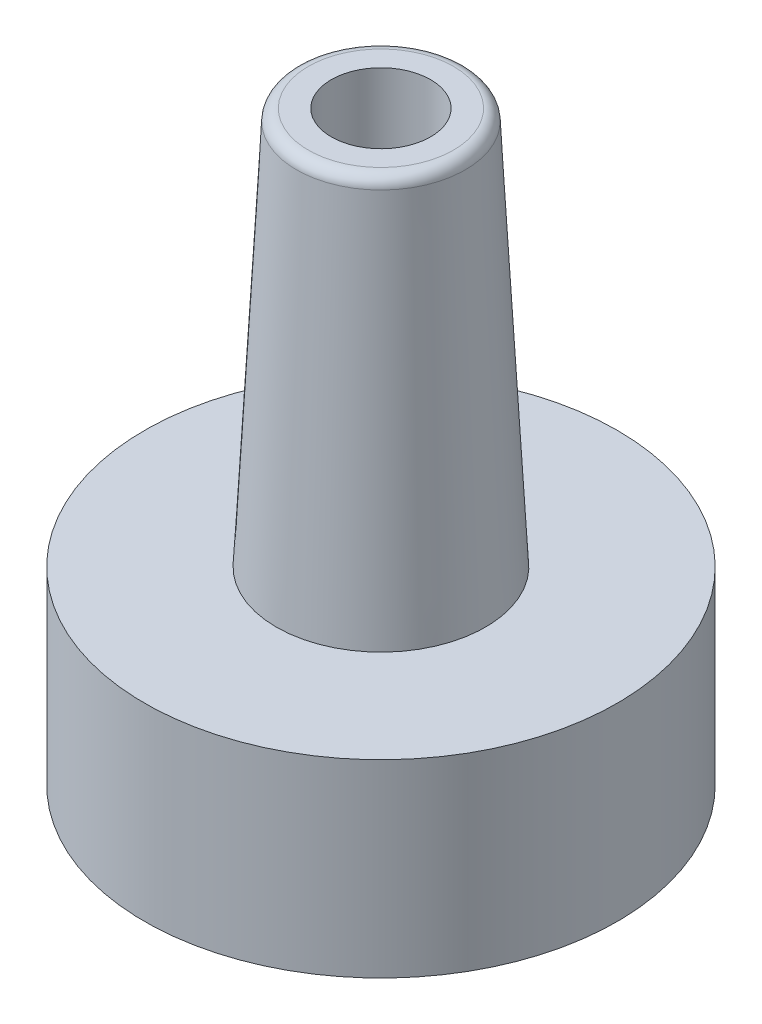
ISO-10303-21;
HEADER;
FILE_DESCRIPTION(('STEP AP214'),'2;1');
FILE_NAME('part.step','',(''),(''),'','','');
FILE_SCHEMA(('AUTOMOTIVE_DESIGN { 1 0 10303 214 1 1 1 1 }'));
ENDSEC;
DATA;
#1=APPLICATION_CONTEXT('core data for automotive mechanical design processes');
#2=APPLICATION_PROTOCOL_DEFINITION('international standard','automotive_design',2000,#1);
#3=PRODUCT_CONTEXT('',#1,'mechanical');
#4=PRODUCT('Part','Part','',(#3));
#5=PRODUCT_RELATED_PRODUCT_CATEGORY('part','',(#4));
#6=PRODUCT_DEFINITION_FORMATION('','',#4);
#7=PRODUCT_DEFINITION_CONTEXT('part definition',#1,'design');
#8=PRODUCT_DEFINITION('design','',#6,#7);
#9=PRODUCT_DEFINITION_SHAPE('','',#8);
#10=(LENGTH_UNIT() NAMED_UNIT(*) SI_UNIT(.MILLI.,.METRE.));
#11=(NAMED_UNIT(*) PLANE_ANGLE_UNIT() SI_UNIT($,.RADIAN.));
#12=(NAMED_UNIT(*) SI_UNIT($,.STERADIAN.) SOLID_ANGLE_UNIT());
#13=UNCERTAINTY_MEASURE_WITH_UNIT(LENGTH_MEASURE(1.E-05),#10,'distance_accuracy_value','');
#14=(GEOMETRIC_REPRESENTATION_CONTEXT(3) GLOBAL_UNCERTAINTY_ASSIGNED_CONTEXT((#13)) GLOBAL_UNIT_ASSIGNED_CONTEXT((#10,
#11,#12)) REPRESENTATION_CONTEXT('',''));
#15=CARTESIAN_POINT('',(0.,0.,0.));
#16=DIRECTION('',(0.,0.,1.));
#17=DIRECTION('',(1.,0.,0.));
#18=AXIS2_PLACEMENT_3D('',#15,#16,#17);
#19=CARTESIAN_POINT('',(0.,0.,0.));
#20=DIRECTION('',(0.,-1.,0.));
#21=DIRECTION('',(0.,0.,-1.));
#22=AXIS2_PLACEMENT_3D('',#19,#20,#21);
#23=CYLINDRICAL_SURFACE('',#22,1.05);
#24=CARTESIAN_POINT('',(0.,8.4,0.));
#25=DIRECTION('',(0.,-1.,0.));
#26=DIRECTION('',(0.,0.,-1.));
#27=AXIS2_PLACEMENT_3D('',#24,#25,#26);
#28=CIRCLE('',#27,1.05);
#29=CARTESIAN_POINT('',(0.,8.4,-1.05));
#30=VERTEX_POINT('',#29);
#31=EDGE_CURVE('E10',#30,#30,#28,.T.);
#32=ORIENTED_EDGE('',*,*,#31,.F.);
#33=EDGE_LOOP('',(#32));
#34=FACE_BOUND('',#33,.T.);
#35=CARTESIAN_POINT('',(0.,0.,0.));
#36=DIRECTION('',(0.,-1.,0.));
#37=DIRECTION('',(0.,0.,-1.));
#38=AXIS2_PLACEMENT_3D('',#35,#36,#37);
#39=CIRCLE('',#38,1.05);
#40=CARTESIAN_POINT('',(0.,0.,-1.05));
#41=VERTEX_POINT('',#40);
#42=EDGE_CURVE('E66',#41,#41,#39,.T.);
#43=ORIENTED_EDGE('',*,*,#42,.T.);
#44=EDGE_LOOP('',(#43));
#45=FACE_BOUND('',#44,.T.);
#46=ADVANCED_FACE('F43',(#34,#45),#23,.F.);
#47=CARTESIAN_POINT('',(-1.05,8.4,0.));
#48=DIRECTION('',(0.,-1.,0.));
#49=DIRECTION('',(0.,0.,-1.));
#50=AXIS2_PLACEMENT_3D('',#47,#48,#49);
#51=PLANE('',#50);
#52=CARTESIAN_POINT('',(0.,8.4,0.));
#53=DIRECTION('',(0.,-1.,0.));
#54=DIRECTION('',(0.,0.,-1.));
#55=AXIS2_PLACEMENT_3D('',#52,#53,#54);
#56=CIRCLE('',#55,1.53553351234379);
#57=CARTESIAN_POINT('',(0.,8.4,-1.53553351234379));
#58=VERTEX_POINT('',#57);
#59=EDGE_CURVE('E50',#58,#58,#56,.T.);
#60=ORIENTED_EDGE('',*,*,#59,.F.);
#61=EDGE_LOOP('',(#60));
#62=FACE_BOUND('',#61,.T.);
#63=ORIENTED_EDGE('',*,*,#31,.T.);
#64=EDGE_LOOP('',(#63));
#65=FACE_BOUND('',#64,.T.);
#66=ADVANCED_FACE('F107',(#62,#65),#51,.F.);
#67=CARTESIAN_POINT('',(0.,8.15,0.));
#68=DIRECTION('',(0.,-1.,0.));
#69=DIRECTION('',(0.,0.,-1.));
#70=AXIS2_PLACEMENT_3D('',#67,#68,#69);
#71=TOROIDAL_SURFACE('',#70,1.53553351234379,0.25);
#72=CARTESIAN_POINT('',(0.,8.16308398906074,0.));
#73=DIRECTION('',(0.,-1.,0.));
#74=DIRECTION('',(0.,0.,-1.));
#75=AXIS2_PLACEMENT_3D('',#72,#73,#74);
#76=CIRCLE('',#75,1.78519089603243);
#77=CARTESIAN_POINT('',(0.,8.16308398906074,-1.78519089603243));
#78=VERTEX_POINT('',#77);
#79=EDGE_CURVE('E55',#78,#78,#76,.T.);
#80=ORIENTED_EDGE('',*,*,#79,.F.);
#81=EDGE_LOOP('',(#80));
#82=FACE_BOUND('',#81,.T.);
#83=ORIENTED_EDGE('',*,*,#59,.T.);
#84=EDGE_LOOP('',(#83));
#85=FACE_BOUND('',#84,.T.);
#86=ADVANCED_FACE('F112',(#82,#85),#71,.T.);
#87=CARTESIAN_POINT('',(0.,8.16308398906074,0.));
#88=DIRECTION('',(0.,-1.,0.));
#89=DIRECTION('',(0.,0.,-1.));
#90=AXIS2_PLACEMENT_3D('',#87,#88,#89);
#91=CONICAL_SURFACE('',#90,1.78519089603243,0.052359877559823);
#92=CARTESIAN_POINT('',(0.,0.,0.));
#93=DIRECTION('',(0.,-1.,0.));
#94=DIRECTION('',(0.,0.,-1.));
#95=AXIS2_PLACEMENT_3D('',#92,#93,#94);
#96=CIRCLE('',#95,2.213);
#97=CARTESIAN_POINT('',(0.,0.,-2.213));
#98=VERTEX_POINT('',#97);
#99=EDGE_CURVE('E60',#98,#98,#96,.T.);
#100=ORIENTED_EDGE('',*,*,#99,.F.);
#101=EDGE_LOOP('',(#100));
#102=FACE_BOUND('',#101,.T.);
#103=ORIENTED_EDGE('',*,*,#79,.T.);
#104=EDGE_LOOP('',(#103));
#105=FACE_BOUND('',#104,.T.);
#106=ADVANCED_FACE('F103',(#102,#105),#91,.T.);
#107=CARTESIAN_POINT('',(0.,0.,0.));
#108=DIRECTION('',(0.,-1.,0.));
#109=DIRECTION('',(0.,0.,-1.));
#110=AXIS2_PLACEMENT_3D('',#107,#108,#109);
#111=PLANE('',#110);
#112=CARTESIAN_POINT('',(0.,0.,0.));
#113=DIRECTION('',(0.,-1.,0.));
#114=DIRECTION('',(0.,0.,-1.));
#115=AXIS2_PLACEMENT_3D('',#112,#113,#114);
#116=CIRCLE('',#115,0.8);
#117=CARTESIAN_POINT('',(0.,0.,-0.8));
#118=VERTEX_POINT('',#117);
#119=EDGE_CURVE('E79',#118,#118,#116,.T.);
#120=ORIENTED_EDGE('',*,*,#119,.T.);
#121=EDGE_LOOP('',(#120));
#122=FACE_BOUND('',#121,.T.);
#123=ORIENTED_EDGE('',*,*,#42,.F.);
#124=EDGE_LOOP('',(#123));
#125=FACE_BOUND('',#124,.T.);
#126=ADVANCED_FACE('F93',(#122,#125),#111,.F.);
#127=CARTESIAN_POINT('',(0.,-4.,0.));
#128=DIRECTION('',(0.,-1.,0.));
#129=DIRECTION('',(0.,0.,-1.));
#130=AXIS2_PLACEMENT_3D('',#127,#128,#129);
#131=PLANE('',#130);
#132=CARTESIAN_POINT('',(0.,-4.,0.));
#133=DIRECTION('',(0.,-1.,0.));
#134=DIRECTION('',(0.,0.,-1.));
#135=AXIS2_PLACEMENT_3D('',#132,#133,#134);
#136=CIRCLE('',#135,5.);
#137=CARTESIAN_POINT('',(0.,-4.,-5.));
#138=VERTEX_POINT('',#137);
#139=EDGE_CURVE('E70',#138,#138,#136,.T.);
#140=ORIENTED_EDGE('',*,*,#139,.T.);
#141=EDGE_LOOP('',(#140));
#142=FACE_BOUND('',#141,.T.);
#143=CARTESIAN_POINT('',(0.,-4.,0.));
#144=DIRECTION('',(0.,-1.,0.));
#145=DIRECTION('',(0.,0.,-1.));
#146=AXIS2_PLACEMENT_3D('',#143,#144,#145);
#147=CIRCLE('',#146,0.8);
#148=CARTESIAN_POINT('',(0.,-4.,-0.8));
#149=VERTEX_POINT('',#148);
#150=EDGE_CURVE('E75',#149,#149,#147,.T.);
#151=ORIENTED_EDGE('',*,*,#150,.F.);
#152=EDGE_LOOP('',(#151));
#153=FACE_BOUND('',#152,.T.);
#154=ADVANCED_FACE('F90',(#142,#153),#131,.T.);
#155=ORIENTED_EDGE('',*,*,#99,.T.);
#156=EDGE_LOOP('',(#155));
#157=FACE_BOUND('',#156,.T.);
#158=CARTESIAN_POINT('',(0.,0.,0.));
#159=DIRECTION('',(0.,-1.,0.));
#160=DIRECTION('',(0.,0.,-1.));
#161=AXIS2_PLACEMENT_3D('',#158,#159,#160);
#162=CIRCLE('',#161,5.);
#163=CARTESIAN_POINT('',(0.,0.,-5.));
#164=VERTEX_POINT('',#163);
#165=EDGE_CURVE('E71',#164,#164,#162,.T.);
#166=ORIENTED_EDGE('',*,*,#165,.F.);
#167=EDGE_LOOP('',(#166));
#168=FACE_BOUND('',#167,.T.);
#169=ADVANCED_FACE('F92',(#157,#168),#111,.F.);
#170=CARTESIAN_POINT('',(0.,-4.,0.));
#171=DIRECTION('',(0.,1.,0.));
#172=DIRECTION('',(0.,0.,1.));
#173=AXIS2_PLACEMENT_3D('',#170,#171,#172);
#174=CYLINDRICAL_SURFACE('',#173,5.);
#175=ORIENTED_EDGE('',*,*,#139,.F.);
#176=EDGE_LOOP('',(#175));
#177=FACE_BOUND('',#176,.T.);
#178=ORIENTED_EDGE('',*,*,#165,.T.);
#179=EDGE_LOOP('',(#178));
#180=FACE_BOUND('',#179,.T.);
#181=ADVANCED_FACE('F100',(#177,#180),#174,.T.);
#182=CARTESIAN_POINT('',(0.,-4.,0.));
#183=DIRECTION('',(0.,1.,0.));
#184=DIRECTION('',(0.,0.,1.));
#185=AXIS2_PLACEMENT_3D('',#182,#183,#184);
#186=CYLINDRICAL_SURFACE('',#185,0.8);
#187=ORIENTED_EDGE('',*,*,#150,.T.);
#188=EDGE_LOOP('',(#187));
#189=FACE_BOUND('',#188,.T.);
#190=ORIENTED_EDGE('',*,*,#119,.F.);
#191=EDGE_LOOP('',(#190));
#192=FACE_BOUND('',#191,.T.);
#193=ADVANCED_FACE('F87',(#189,#192),#186,.F.);
#194=CLOSED_SHELL('',(#46,#66,#86,#106,#126,#154,#169,#181,#193));
#195=MANIFOLD_SOLID_BREP('B2',#194);
#196=ADVANCED_BREP_SHAPE_REPRESENTATION('',(#18,#195),#14);
#197=SHAPE_DEFINITION_REPRESENTATION(#9,#196);
ENDSEC;
END-ISO-10303-21;
